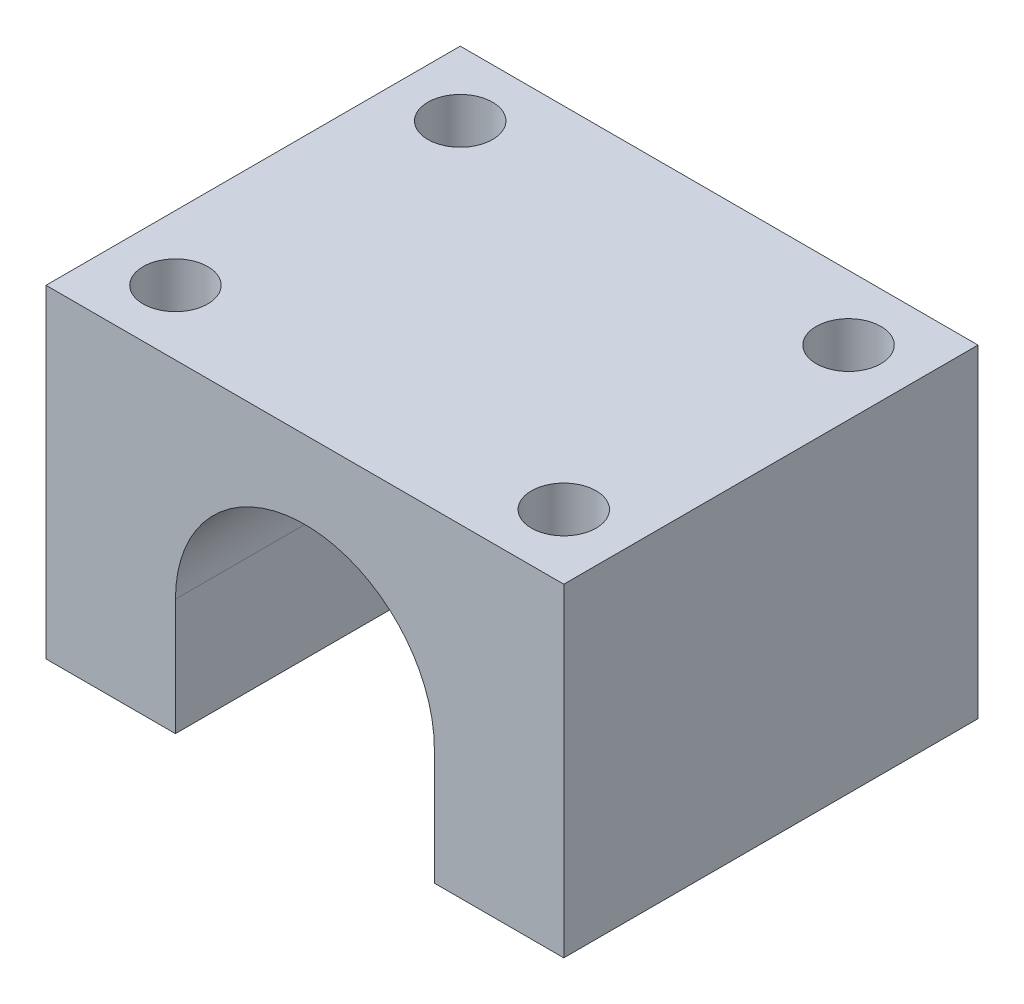
ISO-10303-21;
HEADER;
FILE_DESCRIPTION(('STEP AP214'),'2;1');
FILE_NAME('part.step','',(''),(''),'','','');
FILE_SCHEMA(('AUTOMOTIVE_DESIGN { 1 0 10303 214 1 1 1 1 }'));
ENDSEC;
DATA;
#1=APPLICATION_CONTEXT('core data for automotive mechanical design processes');
#2=APPLICATION_PROTOCOL_DEFINITION('international standard','automotive_design',2000,#1);
#3=PRODUCT_CONTEXT('',#1,'mechanical');
#4=PRODUCT('Part','Part','',(#3));
#5=PRODUCT_RELATED_PRODUCT_CATEGORY('part','',(#4));
#6=PRODUCT_DEFINITION_FORMATION('','',#4);
#7=PRODUCT_DEFINITION_CONTEXT('part definition',#1,'design');
#8=PRODUCT_DEFINITION('design','',#6,#7);
#9=PRODUCT_DEFINITION_SHAPE('','',#8);
#10=(LENGTH_UNIT() NAMED_UNIT(*) SI_UNIT(.MILLI.,.METRE.));
#11=(NAMED_UNIT(*) PLANE_ANGLE_UNIT() SI_UNIT($,.RADIAN.));
#12=(NAMED_UNIT(*) SI_UNIT($,.STERADIAN.) SOLID_ANGLE_UNIT());
#13=UNCERTAINTY_MEASURE_WITH_UNIT(LENGTH_MEASURE(1.E-05),#10,'distance_accuracy_value','');
#14=(GEOMETRIC_REPRESENTATION_CONTEXT(3) GLOBAL_UNCERTAINTY_ASSIGNED_CONTEXT((#13)) GLOBAL_UNIT_ASSIGNED_CONTEXT((#10,
#11,#12)) REPRESENTATION_CONTEXT('',''));
#15=CARTESIAN_POINT('',(0.,0.,0.));
#16=DIRECTION('',(0.,0.,1.));
#17=DIRECTION('',(1.,0.,0.));
#18=AXIS2_PLACEMENT_3D('',#15,#16,#17);
#19=CARTESIAN_POINT('',(0.,0.,40.64));
#20=DIRECTION('',(1.,0.,0.));
#21=DIRECTION('',(0.,0.,-1.));
#22=AXIS2_PLACEMENT_3D('',#19,#20,#21);
#23=PLANE('',#22);
#24=DIRECTION('',(0.,-1.,0.));
#25=VECTOR('',#24,1.);
#26=CARTESIAN_POINT('',(0.,0.,0.));
#27=LINE('',#26,#25);
#28=CARTESIAN_POINT('',(0.,0.,0.));
#29=VERTEX_POINT('',#28);
#30=CARTESIAN_POINT('',(0.,-31.75,0.));
#31=VERTEX_POINT('',#30);
#32=EDGE_CURVE('E129',#29,#31,#27,.T.);
#33=ORIENTED_EDGE('',*,*,#32,.T.);
#34=DIRECTION('',(0.,0.,-1.));
#35=VECTOR('',#34,1.);
#36=CARTESIAN_POINT('',(0.,-31.75,40.64));
#37=LINE('',#36,#35);
#38=CARTESIAN_POINT('',(0.,-31.75,40.64));
#39=VERTEX_POINT('',#38);
#40=EDGE_CURVE('E11',#39,#31,#37,.T.);
#41=ORIENTED_EDGE('',*,*,#40,.F.);
#42=DIRECTION('',(0.,-1.,0.));
#43=VECTOR('',#42,1.);
#44=CARTESIAN_POINT('',(0.,0.,40.64));
#45=LINE('',#44,#43);
#46=CARTESIAN_POINT('',(0.,0.,40.64));
#47=VERTEX_POINT('',#46);
#48=EDGE_CURVE('E144',#47,#39,#45,.T.);
#49=ORIENTED_EDGE('',*,*,#48,.F.);
#50=DIRECTION('',(0.,0.,-1.));
#51=VECTOR('',#50,1.);
#52=CARTESIAN_POINT('',(0.,0.,40.64));
#53=LINE('',#52,#51);
#54=EDGE_CURVE('E125',#47,#29,#53,.T.);
#55=ORIENTED_EDGE('',*,*,#54,.T.);
#56=EDGE_LOOP('',(#33,#41,#49,#55));
#57=FACE_BOUND('',#56,.T.);
#58=ADVANCED_FACE('F33',(#57),#23,.F.);
#59=CARTESIAN_POINT('',(0.,-31.75,40.64));
#60=DIRECTION('',(0.,1.,0.));
#61=DIRECTION('',(0.,0.,1.));
#62=AXIS2_PLACEMENT_3D('',#59,#60,#61);
#63=PLANE('',#62);
#64=CARTESIAN_POINT('',(6.35,-31.75,34.29));
#65=DIRECTION('',(0.,1.,0.));
#66=DIRECTION('',(0.,0.,-1.));
#67=AXIS2_PLACEMENT_3D('',#64,#65,#66);
#68=CIRCLE('',#67,3.175);
#69=CARTESIAN_POINT('',(6.35,-31.75,31.115));
#70=VERTEX_POINT('',#69);
#71=EDGE_CURVE('E186',#70,#70,#68,.T.);
#72=ORIENTED_EDGE('',*,*,#71,.T.);
#73=EDGE_LOOP('',(#72));
#74=FACE_BOUND('',#73,.T.);
#75=CARTESIAN_POINT('',(6.35,-31.75,6.35));
#76=DIRECTION('',(0.,1.,0.));
#77=DIRECTION('',(0.,0.,1.));
#78=AXIS2_PLACEMENT_3D('',#75,#76,#77);
#79=CIRCLE('',#78,3.175);
#80=CARTESIAN_POINT('',(6.35,-31.75,9.525));
#81=VERTEX_POINT('',#80);
#82=EDGE_CURVE('E133',#81,#81,#79,.T.);
#83=ORIENTED_EDGE('',*,*,#82,.T.);
#84=EDGE_LOOP('',(#83));
#85=FACE_BOUND('',#84,.T.);
#86=DIRECTION('',(1.,0.,0.));
#87=VECTOR('',#86,1.);
#88=CARTESIAN_POINT('',(0.,-31.75,0.));
#89=LINE('',#88,#87);
#90=CARTESIAN_POINT('',(12.7,-31.75,0.));
#91=VERTEX_POINT('',#90);
#92=EDGE_CURVE('E132',#31,#91,#89,.T.);
#93=ORIENTED_EDGE('',*,*,#92,.T.);
#94=DIRECTION('',(0.,0.,-1.));
#95=VECTOR('',#94,1.);
#96=CARTESIAN_POINT('',(12.7,-31.75,40.64));
#97=LINE('',#96,#95);
#98=CARTESIAN_POINT('',(12.7,-31.75,40.64));
#99=VERTEX_POINT('',#98);
#100=EDGE_CURVE('E41',#99,#91,#97,.T.);
#101=ORIENTED_EDGE('',*,*,#100,.F.);
#102=DIRECTION('',(1.,0.,0.));
#103=VECTOR('',#102,1.);
#104=CARTESIAN_POINT('',(0.,-31.75,40.64));
#105=LINE('',#104,#103);
#106=EDGE_CURVE('E92',#39,#99,#105,.T.);
#107=ORIENTED_EDGE('',*,*,#106,.F.);
#108=ORIENTED_EDGE('',*,*,#40,.T.);
#109=EDGE_LOOP('',(#93,#101,#107,#108));
#110=FACE_BOUND('',#109,.T.);
#111=ADVANCED_FACE('F235',(#74,#85,#110),#63,.F.);
#112=CARTESIAN_POINT('',(12.7,-31.75,40.64));
#113=DIRECTION('',(-1.,0.,0.));
#114=DIRECTION('',(0.,0.,1.));
#115=AXIS2_PLACEMENT_3D('',#112,#113,#114);
#116=PLANE('',#115);
#117=DIRECTION('',(0.,1.,0.));
#118=VECTOR('',#117,1.);
#119=CARTESIAN_POINT('',(12.7,-31.75,0.));
#120=LINE('',#119,#118);
#121=CARTESIAN_POINT('',(12.7,-20.32,0.));
#122=VERTEX_POINT('',#121);
#123=EDGE_CURVE('E135',#91,#122,#120,.T.);
#124=ORIENTED_EDGE('',*,*,#123,.T.);
#125=DIRECTION('',(0.,0.,-1.));
#126=VECTOR('',#125,1.);
#127=CARTESIAN_POINT('',(12.7,-20.32,40.64));
#128=LINE('',#127,#126);
#129=CARTESIAN_POINT('',(12.7,-20.32,40.64));
#130=VERTEX_POINT('',#129);
#131=EDGE_CURVE('E151',#130,#122,#128,.T.);
#132=ORIENTED_EDGE('',*,*,#131,.F.);
#133=DIRECTION('',(0.,1.,0.));
#134=VECTOR('',#133,1.);
#135=CARTESIAN_POINT('',(12.7,-31.75,40.64));
#136=LINE('',#135,#134);
#137=EDGE_CURVE('E159',#99,#130,#136,.T.);
#138=ORIENTED_EDGE('',*,*,#137,.F.);
#139=ORIENTED_EDGE('',*,*,#100,.T.);
#140=EDGE_LOOP('',(#124,#132,#138,#139));
#141=FACE_BOUND('',#140,.T.);
#142=ADVANCED_FACE('F157',(#141),#116,.F.);
#143=CARTESIAN_POINT('',(25.4,-20.32,40.64));
#144=DIRECTION('',(0.,0.,-1.));
#145=DIRECTION('',(-1.,0.,0.));
#146=AXIS2_PLACEMENT_3D('',#143,#144,#145);
#147=CYLINDRICAL_SURFACE('',#146,12.7);
#148=CARTESIAN_POINT('',(25.4,-20.32,0.));
#149=DIRECTION('',(0.,0.,-1.));
#150=DIRECTION('',(1.,0.,0.));
#151=AXIS2_PLACEMENT_3D('',#148,#149,#150);
#152=CIRCLE('',#151,12.7);
#153=CARTESIAN_POINT('',(38.1,-20.32,0.));
#154=VERTEX_POINT('',#153);
#155=EDGE_CURVE('E137',#122,#154,#152,.T.);
#156=ORIENTED_EDGE('',*,*,#155,.T.);
#157=DIRECTION('',(0.,0.,-1.));
#158=VECTOR('',#157,1.);
#159=CARTESIAN_POINT('',(38.1,-20.32,40.64));
#160=LINE('',#159,#158);
#161=CARTESIAN_POINT('',(38.1,-20.32,40.64));
#162=VERTEX_POINT('',#161);
#163=EDGE_CURVE('E148',#162,#154,#160,.T.);
#164=ORIENTED_EDGE('',*,*,#163,.F.);
#165=CARTESIAN_POINT('',(25.4,-20.32,40.64));
#166=DIRECTION('',(0.,0.,-1.));
#167=DIRECTION('',(1.,0.,0.));
#168=AXIS2_PLACEMENT_3D('',#165,#166,#167);
#169=CIRCLE('',#168,12.7);
#170=EDGE_CURVE('E171',#130,#162,#169,.T.);
#171=ORIENTED_EDGE('',*,*,#170,.F.);
#172=ORIENTED_EDGE('',*,*,#131,.T.);
#173=EDGE_LOOP('',(#156,#164,#171,#172));
#174=FACE_BOUND('',#173,.T.);
#175=ADVANCED_FACE('F167',(#174),#147,.F.);
#176=CARTESIAN_POINT('',(38.1,-31.75,40.64));
#177=DIRECTION('',(1.,0.,0.));
#178=DIRECTION('',(0.,0.,-1.));
#179=AXIS2_PLACEMENT_3D('',#176,#177,#178);
#180=PLANE('',#179);
#181=DIRECTION('',(0.,-1.,0.));
#182=VECTOR('',#181,1.);
#183=CARTESIAN_POINT('',(38.1,-31.75,0.));
#184=LINE('',#183,#182);
#185=CARTESIAN_POINT('',(38.1,-31.75,0.));
#186=VERTEX_POINT('',#185);
#187=EDGE_CURVE('E139',#154,#186,#184,.T.);
#188=ORIENTED_EDGE('',*,*,#187,.T.);
#189=DIRECTION('',(0.,0.,-1.));
#190=VECTOR('',#189,1.);
#191=CARTESIAN_POINT('',(38.1,-31.75,40.64));
#192=LINE('',#191,#190);
#193=CARTESIAN_POINT('',(38.1,-31.75,40.64));
#194=VERTEX_POINT('',#193);
#195=EDGE_CURVE('E120',#194,#186,#192,.T.);
#196=ORIENTED_EDGE('',*,*,#195,.F.);
#197=DIRECTION('',(0.,-1.,0.));
#198=VECTOR('',#197,1.);
#199=CARTESIAN_POINT('',(38.1,-31.75,40.64));
#200=LINE('',#199,#198);
#201=EDGE_CURVE('E111',#162,#194,#200,.T.);
#202=ORIENTED_EDGE('',*,*,#201,.F.);
#203=ORIENTED_EDGE('',*,*,#163,.T.);
#204=EDGE_LOOP('',(#188,#196,#202,#203));
#205=FACE_BOUND('',#204,.T.);
#206=ADVANCED_FACE('F170',(#205),#180,.F.);
#207=CARTESIAN_POINT('',(50.8,-31.75,40.64));
#208=DIRECTION('',(0.,1.,0.));
#209=DIRECTION('',(0.,0.,1.));
#210=AXIS2_PLACEMENT_3D('',#207,#208,#209);
#211=PLANE('',#210);
#212=CARTESIAN_POINT('',(44.45,-31.75,34.29));
#213=DIRECTION('',(0.,1.,0.));
#214=DIRECTION('',(0.,0.,1.));
#215=AXIS2_PLACEMENT_3D('',#212,#213,#214);
#216=CIRCLE('',#215,3.175);
#217=CARTESIAN_POINT('',(44.45,-31.75,37.465));
#218=VERTEX_POINT('',#217);
#219=EDGE_CURVE('E192',#218,#218,#216,.T.);
#220=ORIENTED_EDGE('',*,*,#219,.T.);
#221=EDGE_LOOP('',(#220));
#222=FACE_BOUND('',#221,.T.);
#223=CARTESIAN_POINT('',(44.45,-31.75,6.35));
#224=DIRECTION('',(0.,1.,0.));
#225=DIRECTION('',(0.,0.,-1.));
#226=AXIS2_PLACEMENT_3D('',#223,#224,#225);
#227=CIRCLE('',#226,3.175);
#228=CARTESIAN_POINT('',(44.45,-31.75,3.175));
#229=VERTEX_POINT('',#228);
#230=EDGE_CURVE('E180',#229,#229,#227,.T.);
#231=ORIENTED_EDGE('',*,*,#230,.T.);
#232=EDGE_LOOP('',(#231));
#233=FACE_BOUND('',#232,.T.);
#234=DIRECTION('',(1.,0.,0.));
#235=VECTOR('',#234,1.);
#236=CARTESIAN_POINT('',(50.8,-31.75,0.));
#237=LINE('',#236,#235);
#238=CARTESIAN_POINT('',(50.8,-31.75,0.));
#239=VERTEX_POINT('',#238);
#240=EDGE_CURVE('E119',#186,#239,#237,.T.);
#241=ORIENTED_EDGE('',*,*,#240,.T.);
#242=DIRECTION('',(0.,0.,-1.));
#243=VECTOR('',#242,1.);
#244=CARTESIAN_POINT('',(50.8,-31.75,40.64));
#245=LINE('',#244,#243);
#246=CARTESIAN_POINT('',(50.8,-31.75,40.64));
#247=VERTEX_POINT('',#246);
#248=EDGE_CURVE('E116',#247,#239,#245,.T.);
#249=ORIENTED_EDGE('',*,*,#248,.F.);
#250=DIRECTION('',(1.,0.,0.));
#251=VECTOR('',#250,1.);
#252=CARTESIAN_POINT('',(50.8,-31.75,40.64));
#253=LINE('',#252,#251);
#254=EDGE_CURVE('E105',#194,#247,#253,.T.);
#255=ORIENTED_EDGE('',*,*,#254,.F.);
#256=ORIENTED_EDGE('',*,*,#195,.T.);
#257=EDGE_LOOP('',(#241,#249,#255,#256));
#258=FACE_BOUND('',#257,.T.);
#259=ADVANCED_FACE('F117',(#222,#233,#258),#211,.F.);
#260=CARTESIAN_POINT('',(50.8,0.,40.64));
#261=DIRECTION('',(-1.,0.,0.));
#262=DIRECTION('',(0.,-1.,0.));
#263=AXIS2_PLACEMENT_3D('',#260,#261,#262);
#264=PLANE('',#263);
#265=DIRECTION('',(0.,1.,0.));
#266=VECTOR('',#265,1.);
#267=CARTESIAN_POINT('',(50.8,0.,0.));
#268=LINE('',#267,#266);
#269=CARTESIAN_POINT('',(50.8,0.,0.));
#270=VERTEX_POINT('',#269);
#271=EDGE_CURVE('E78',#239,#270,#268,.T.);
#272=ORIENTED_EDGE('',*,*,#271,.T.);
#273=DIRECTION('',(0.,0.,-1.));
#274=VECTOR('',#273,1.);
#275=CARTESIAN_POINT('',(50.8,0.,40.64));
#276=LINE('',#275,#274);
#277=CARTESIAN_POINT('',(50.8,0.,40.64));
#278=VERTEX_POINT('',#277);
#279=EDGE_CURVE('E121',#278,#270,#276,.T.);
#280=ORIENTED_EDGE('',*,*,#279,.F.);
#281=DIRECTION('',(0.,1.,0.));
#282=VECTOR('',#281,1.);
#283=CARTESIAN_POINT('',(50.8,0.,40.64));
#284=LINE('',#283,#282);
#285=EDGE_CURVE('E109',#247,#278,#284,.T.);
#286=ORIENTED_EDGE('',*,*,#285,.F.);
#287=ORIENTED_EDGE('',*,*,#248,.T.);
#288=EDGE_LOOP('',(#272,#280,#286,#287));
#289=FACE_BOUND('',#288,.T.);
#290=ADVANCED_FACE('F123',(#289),#264,.F.);
#291=CARTESIAN_POINT('',(0.,0.,40.64));
#292=DIRECTION('',(0.,-1.,0.));
#293=DIRECTION('',(0.,0.,-1.));
#294=AXIS2_PLACEMENT_3D('',#291,#292,#293);
#295=PLANE('',#294);
#296=CARTESIAN_POINT('',(44.45,0.,34.29));
#297=DIRECTION('',(0.,1.,0.));
#298=DIRECTION('',(0.,0.,1.));
#299=AXIS2_PLACEMENT_3D('',#296,#297,#298);
#300=CIRCLE('',#299,3.175);
#301=CARTESIAN_POINT('',(44.45,0.,37.465));
#302=VERTEX_POINT('',#301);
#303=EDGE_CURVE('E195',#302,#302,#300,.T.);
#304=ORIENTED_EDGE('',*,*,#303,.F.);
#305=EDGE_LOOP('',(#304));
#306=FACE_BOUND('',#305,.T.);
#307=CARTESIAN_POINT('',(6.35,0.,34.29));
#308=DIRECTION('',(0.,1.,0.));
#309=DIRECTION('',(0.,0.,-1.));
#310=AXIS2_PLACEMENT_3D('',#307,#308,#309);
#311=CIRCLE('',#310,3.175);
#312=CARTESIAN_POINT('',(6.35,0.,31.115));
#313=VERTEX_POINT('',#312);
#314=EDGE_CURVE('E189',#313,#313,#311,.T.);
#315=ORIENTED_EDGE('',*,*,#314,.F.);
#316=EDGE_LOOP('',(#315));
#317=FACE_BOUND('',#316,.T.);
#318=CARTESIAN_POINT('',(44.45,0.,6.35));
#319=DIRECTION('',(0.,1.,0.));
#320=DIRECTION('',(0.,0.,-1.));
#321=AXIS2_PLACEMENT_3D('',#318,#319,#320);
#322=CIRCLE('',#321,3.175);
#323=CARTESIAN_POINT('',(44.45,0.,3.175));
#324=VERTEX_POINT('',#323);
#325=EDGE_CURVE('E183',#324,#324,#322,.T.);
#326=ORIENTED_EDGE('',*,*,#325,.F.);
#327=EDGE_LOOP('',(#326));
#328=FACE_BOUND('',#327,.T.);
#329=CARTESIAN_POINT('',(6.35,0.,6.35));
#330=DIRECTION('',(0.,1.,0.));
#331=DIRECTION('',(0.,0.,1.));
#332=AXIS2_PLACEMENT_3D('',#329,#330,#331);
#333=CIRCLE('',#332,3.175);
#334=CARTESIAN_POINT('',(6.35,0.,9.525));
#335=VERTEX_POINT('',#334);
#336=EDGE_CURVE('E177',#335,#335,#333,.T.);
#337=ORIENTED_EDGE('',*,*,#336,.F.);
#338=EDGE_LOOP('',(#337));
#339=FACE_BOUND('',#338,.T.);
#340=DIRECTION('',(-1.,0.,0.));
#341=VECTOR('',#340,1.);
#342=CARTESIAN_POINT('',(0.,0.,0.));
#343=LINE('',#342,#341);
#344=EDGE_CURVE('E84',#270,#29,#343,.T.);
#345=ORIENTED_EDGE('',*,*,#344,.T.);
#346=ORIENTED_EDGE('',*,*,#54,.F.);
#347=DIRECTION('',(-1.,0.,0.));
#348=VECTOR('',#347,1.);
#349=CARTESIAN_POINT('',(0.,0.,40.64));
#350=LINE('',#349,#348);
#351=EDGE_CURVE('E49',#278,#47,#350,.T.);
#352=ORIENTED_EDGE('',*,*,#351,.F.);
#353=ORIENTED_EDGE('',*,*,#279,.T.);
#354=EDGE_LOOP('',(#345,#346,#352,#353));
#355=FACE_BOUND('',#354,.T.);
#356=ADVANCED_FACE('F210',(#306,#317,#328,#339,#355),#295,.F.);
#357=CARTESIAN_POINT('',(25.4,-20.32,40.64));
#358=DIRECTION('',(0.,0.,1.));
#359=DIRECTION('',(1.,0.,0.));
#360=AXIS2_PLACEMENT_3D('',#357,#358,#359);
#361=PLANE('',#360);
#362=ORIENTED_EDGE('',*,*,#48,.T.);
#363=ORIENTED_EDGE('',*,*,#106,.T.);
#364=ORIENTED_EDGE('',*,*,#137,.T.);
#365=ORIENTED_EDGE('',*,*,#170,.T.);
#366=ORIENTED_EDGE('',*,*,#201,.T.);
#367=ORIENTED_EDGE('',*,*,#254,.T.);
#368=ORIENTED_EDGE('',*,*,#285,.T.);
#369=ORIENTED_EDGE('',*,*,#351,.T.);
#370=EDGE_LOOP('',(#362,#363,#364,#365,#366,#367,#368,#369));
#371=FACE_BOUND('',#370,.T.);
#372=ADVANCED_FACE('F107',(#371),#361,.T.);
#373=CARTESIAN_POINT('',(25.4,-20.32,0.));
#374=DIRECTION('',(0.,0.,1.));
#375=DIRECTION('',(1.,0.,0.));
#376=AXIS2_PLACEMENT_3D('',#373,#374,#375);
#377=PLANE('',#376);
#378=ORIENTED_EDGE('',*,*,#32,.F.);
#379=ORIENTED_EDGE('',*,*,#344,.F.);
#380=ORIENTED_EDGE('',*,*,#271,.F.);
#381=ORIENTED_EDGE('',*,*,#240,.F.);
#382=ORIENTED_EDGE('',*,*,#187,.F.);
#383=ORIENTED_EDGE('',*,*,#155,.F.);
#384=ORIENTED_EDGE('',*,*,#123,.F.);
#385=ORIENTED_EDGE('',*,*,#92,.F.);
#386=EDGE_LOOP('',(#378,#379,#380,#381,#382,#383,#384,#385));
#387=FACE_BOUND('',#386,.T.);
#388=ADVANCED_FACE('F163',(#387),#377,.F.);
#389=CARTESIAN_POINT('',(6.35,-31.75,6.35));
#390=DIRECTION('',(0.,1.,0.));
#391=DIRECTION('',(0.,0.,1.));
#392=AXIS2_PLACEMENT_3D('',#389,#390,#391);
#393=CYLINDRICAL_SURFACE('',#392,3.175);
#394=ORIENTED_EDGE('',*,*,#82,.F.);
#395=EDGE_LOOP('',(#394));
#396=FACE_BOUND('',#395,.T.);
#397=ORIENTED_EDGE('',*,*,#336,.T.);
#398=EDGE_LOOP('',(#397));
#399=FACE_BOUND('',#398,.T.);
#400=ADVANCED_FACE('F220',(#396,#399),#393,.F.);
#401=CARTESIAN_POINT('',(44.45,-31.75,6.35));
#402=DIRECTION('',(0.,1.,0.));
#403=DIRECTION('',(0.,0.,1.));
#404=AXIS2_PLACEMENT_3D('',#401,#402,#403);
#405=CYLINDRICAL_SURFACE('',#404,3.175);
#406=ORIENTED_EDGE('',*,*,#230,.F.);
#407=EDGE_LOOP('',(#406));
#408=FACE_BOUND('',#407,.T.);
#409=ORIENTED_EDGE('',*,*,#325,.T.);
#410=EDGE_LOOP('',(#409));
#411=FACE_BOUND('',#410,.T.);
#412=ADVANCED_FACE('F222',(#408,#411),#405,.F.);
#413=CARTESIAN_POINT('',(6.35,-31.75,34.29));
#414=DIRECTION('',(0.,1.,0.));
#415=DIRECTION('',(0.,0.,1.));
#416=AXIS2_PLACEMENT_3D('',#413,#414,#415);
#417=CYLINDRICAL_SURFACE('',#416,3.175);
#418=ORIENTED_EDGE('',*,*,#71,.F.);
#419=EDGE_LOOP('',(#418));
#420=FACE_BOUND('',#419,.T.);
#421=ORIENTED_EDGE('',*,*,#314,.T.);
#422=EDGE_LOOP('',(#421));
#423=FACE_BOUND('',#422,.T.);
#424=ADVANCED_FACE('F206',(#420,#423),#417,.F.);
#425=CARTESIAN_POINT('',(44.45,-31.75,34.29));
#426=DIRECTION('',(0.,1.,0.));
#427=DIRECTION('',(0.,0.,1.));
#428=AXIS2_PLACEMENT_3D('',#425,#426,#427);
#429=CYLINDRICAL_SURFACE('',#428,3.175);
#430=ORIENTED_EDGE('',*,*,#219,.F.);
#431=EDGE_LOOP('',(#430));
#432=FACE_BOUND('',#431,.T.);
#433=ORIENTED_EDGE('',*,*,#303,.T.);
#434=EDGE_LOOP('',(#433));
#435=FACE_BOUND('',#434,.T.);
#436=ADVANCED_FACE('F203',(#432,#435),#429,.F.);
#437=CLOSED_SHELL('',(#58,#111,#142,#175,#206,#259,#290,#356,#372,#388,#400,#412,#424,#436));
#438=MANIFOLD_SOLID_BREP('B2',#437);
#439=ADVANCED_BREP_SHAPE_REPRESENTATION('',(#18,#438),#14);
#440=SHAPE_DEFINITION_REPRESENTATION(#9,#439);
ENDSEC;
END-ISO-10303-21;
